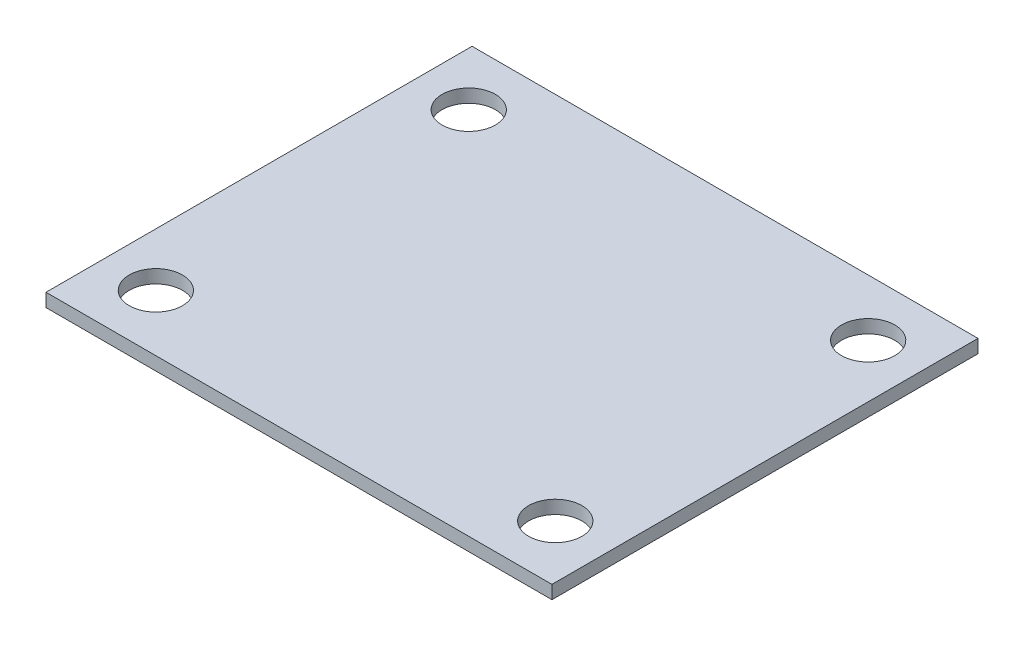
ISO-10303-21;
HEADER;
FILE_DESCRIPTION(('STEP AP214'),'2;1');
FILE_NAME('part.step','',(''),(''),'','','');
FILE_SCHEMA(('AUTOMOTIVE_DESIGN { 1 0 10303 214 1 1 1 1 }'));
ENDSEC;
DATA;
#1=APPLICATION_CONTEXT('core data for automotive mechanical design processes');
#2=APPLICATION_PROTOCOL_DEFINITION('international standard','automotive_design',2000,#1);
#3=PRODUCT_CONTEXT('',#1,'mechanical');
#4=PRODUCT('Part','Part','',(#3));
#5=PRODUCT_RELATED_PRODUCT_CATEGORY('part','',(#4));
#6=PRODUCT_DEFINITION_FORMATION('','',#4);
#7=PRODUCT_DEFINITION_CONTEXT('part definition',#1,'design');
#8=PRODUCT_DEFINITION('design','',#6,#7);
#9=PRODUCT_DEFINITION_SHAPE('','',#8);
#10=(LENGTH_UNIT() NAMED_UNIT(*) SI_UNIT(.MILLI.,.METRE.));
#11=(NAMED_UNIT(*) PLANE_ANGLE_UNIT() SI_UNIT($,.RADIAN.));
#12=(NAMED_UNIT(*) SI_UNIT($,.STERADIAN.) SOLID_ANGLE_UNIT());
#13=UNCERTAINTY_MEASURE_WITH_UNIT(LENGTH_MEASURE(1.E-05),#10,'distance_accuracy_value','');
#14=(GEOMETRIC_REPRESENTATION_CONTEXT(3) GLOBAL_UNCERTAINTY_ASSIGNED_CONTEXT((#13)) GLOBAL_UNIT_ASSIGNED_CONTEXT((#10,
#11,#12)) REPRESENTATION_CONTEXT('',''));
#15=CARTESIAN_POINT('',(0.,0.,0.));
#16=DIRECTION('',(0.,0.,1.));
#17=DIRECTION('',(1.,0.,0.));
#18=AXIS2_PLACEMENT_3D('',#15,#16,#17);
#19=CARTESIAN_POINT('',(0.,-2.,0.));
#20=DIRECTION('',(0.,-1.,0.));
#21=DIRECTION('',(0.,0.,-1.));
#22=AXIS2_PLACEMENT_3D('',#19,#20,#21);
#23=PLANE('',#22);
#24=CARTESIAN_POINT('',(0.,-2.,0.));
#25=DIRECTION('',(0.,-1.,0.));
#26=DIRECTION('',(0.,0.,-1.));
#27=AXIS2_PLACEMENT_3D('',#24,#25,#26);
#28=CIRCLE('',#27,12.);
#29=CARTESIAN_POINT('',(0.,-2.,-12.));
#30=VERTEX_POINT('',#29);
#31=EDGE_CURVE('E144',#30,#30,#28,.T.);
#32=ORIENTED_EDGE('',*,*,#31,.T.);
#33=EDGE_LOOP('',(#32));
#34=FACE_BOUND('',#33,.T.);
#35=CARTESIAN_POINT('',(0.,-2.,0.));
#36=DIRECTION('',(0.,-1.,0.));
#37=DIRECTION('',(0.,0.,-1.));
#38=AXIS2_PLACEMENT_3D('',#35,#36,#37);
#39=CIRCLE('',#38,9.);
#40=CARTESIAN_POINT('',(0.,-2.,-9.));
#41=VERTEX_POINT('',#40);
#42=EDGE_CURVE('E305',#41,#41,#39,.T.);
#43=ORIENTED_EDGE('',*,*,#42,.F.);
#44=EDGE_LOOP('',(#43));
#45=FACE_BOUND('',#44,.T.);
#46=ADVANCED_FACE('F38',(#34,#45),#23,.T.);
#47=CARTESIAN_POINT('',(-19.,1.,16.));
#48=DIRECTION('',(0.,1.,0.));
#49=DIRECTION('',(0.,0.,1.));
#50=AXIS2_PLACEMENT_3D('',#47,#48,#49);
#51=PLANE('',#50);
#52=CARTESIAN_POINT('',(-15.,1.,11.75));
#53=DIRECTION('',(0.,-1.,0.));
#54=DIRECTION('',(0.,0.,1.));
#55=AXIS2_PLACEMENT_3D('',#52,#53,#54);
#56=CIRCLE('',#55,2.00000000000001);
#57=CARTESIAN_POINT('',(-15.,1.,13.75));
#58=VERTEX_POINT('',#57);
#59=EDGE_CURVE('E124',#58,#58,#56,.T.);
#60=ORIENTED_EDGE('',*,*,#59,.T.);
#61=EDGE_LOOP('',(#60));
#62=FACE_BOUND('',#61,.T.);
#63=CARTESIAN_POINT('',(15.,1.,11.75));
#64=DIRECTION('',(0.,1.,0.));
#65=DIRECTION('',(0.,0.,1.));
#66=AXIS2_PLACEMENT_3D('',#63,#64,#65);
#67=CIRCLE('',#66,2.00000000000001);
#68=CARTESIAN_POINT('',(15.,1.,13.75));
#69=VERTEX_POINT('',#68);
#70=EDGE_CURVE('E118',#69,#69,#67,.T.);
#71=ORIENTED_EDGE('',*,*,#70,.F.);
#72=EDGE_LOOP('',(#71));
#73=FACE_BOUND('',#72,.T.);
#74=DIRECTION('',(0.,0.,1.));
#75=VECTOR('',#74,1.);
#76=CARTESIAN_POINT('',(-19.,1.,-16.));
#77=LINE('',#76,#75);
#78=CARTESIAN_POINT('',(-19.,1.,-16.));
#79=VERTEX_POINT('',#78);
#80=CARTESIAN_POINT('',(-19.,1.,16.));
#81=VERTEX_POINT('',#80);
#82=EDGE_CURVE('E91',#79,#81,#77,.T.);
#83=ORIENTED_EDGE('',*,*,#82,.T.);
#84=DIRECTION('',(1.,0.,0.));
#85=VECTOR('',#84,1.);
#86=CARTESIAN_POINT('',(-19.,1.,16.));
#87=LINE('',#86,#85);
#88=CARTESIAN_POINT('',(19.,1.,16.));
#89=VERTEX_POINT('',#88);
#90=EDGE_CURVE('E85',#81,#89,#87,.T.);
#91=ORIENTED_EDGE('',*,*,#90,.T.);
#92=DIRECTION('',(0.,0.,-1.));
#93=VECTOR('',#92,1.);
#94=CARTESIAN_POINT('',(19.,1.,-16.));
#95=LINE('',#94,#93);
#96=CARTESIAN_POINT('',(19.,1.,-16.));
#97=VERTEX_POINT('',#96);
#98=EDGE_CURVE('E89',#89,#97,#95,.T.);
#99=ORIENTED_EDGE('',*,*,#98,.T.);
#100=DIRECTION('',(-1.,0.,0.));
#101=VECTOR('',#100,1.);
#102=CARTESIAN_POINT('',(-19.,1.,-16.));
#103=LINE('',#102,#101);
#104=EDGE_CURVE('E55',#97,#79,#103,.T.);
#105=ORIENTED_EDGE('',*,*,#104,.T.);
#106=EDGE_LOOP('',(#83,#91,#99,#105));
#107=FACE_BOUND('',#106,.T.);
#108=CARTESIAN_POINT('',(-15.,1.,-11.75));
#109=DIRECTION('',(0.,1.,0.));
#110=DIRECTION('',(0.,0.,-1.));
#111=AXIS2_PLACEMENT_3D('',#108,#109,#110);
#112=CIRCLE('',#111,2.00000000000001);
#113=CARTESIAN_POINT('',(-15.,1.,-13.75));
#114=VERTEX_POINT('',#113);
#115=EDGE_CURVE('E130',#114,#114,#112,.T.);
#116=ORIENTED_EDGE('',*,*,#115,.F.);
#117=EDGE_LOOP('',(#116));
#118=FACE_BOUND('',#117,.T.);
#119=CARTESIAN_POINT('',(15.,1.,-11.75));
#120=DIRECTION('',(0.,-1.,0.));
#121=DIRECTION('',(0.,0.,-1.));
#122=AXIS2_PLACEMENT_3D('',#119,#120,#121);
#123=CIRCLE('',#122,2.00000000000001);
#124=CARTESIAN_POINT('',(15.,1.,-13.75));
#125=VERTEX_POINT('',#124);
#126=EDGE_CURVE('E136',#125,#125,#123,.T.);
#127=ORIENTED_EDGE('',*,*,#126,.T.);
#128=EDGE_LOOP('',(#127));
#129=FACE_BOUND('',#128,.T.);
#130=ADVANCED_FACE('F86',(#62,#73,#107,#118,#129),#51,.T.);
#131=CARTESIAN_POINT('',(-19.,0.,16.));
#132=DIRECTION('',(0.,1.,0.));
#133=DIRECTION('',(0.,0.,1.));
#134=AXIS2_PLACEMENT_3D('',#131,#132,#133);
#135=PLANE('',#134);
#136=CARTESIAN_POINT('',(0.,0.,0.));
#137=DIRECTION('',(0.,-1.,0.));
#138=DIRECTION('',(0.,0.,-1.));
#139=AXIS2_PLACEMENT_3D('',#136,#137,#138);
#140=CIRCLE('',#139,15.);
#141=CARTESIAN_POINT('',(0.,0.,-15.));
#142=VERTEX_POINT('',#141);
#143=EDGE_CURVE('E139',#142,#142,#140,.T.);
#144=ORIENTED_EDGE('',*,*,#143,.F.);
#145=EDGE_LOOP('',(#144));
#146=FACE_BOUND('',#145,.T.);
#147=CARTESIAN_POINT('',(-15.,0.,11.75));
#148=DIRECTION('',(0.,-1.,0.));
#149=DIRECTION('',(0.,0.,1.));
#150=AXIS2_PLACEMENT_3D('',#147,#148,#149);
#151=CIRCLE('',#150,2.00000000000001);
#152=CARTESIAN_POINT('',(-15.,0.,13.75));
#153=VERTEX_POINT('',#152);
#154=EDGE_CURVE('E121',#153,#153,#151,.T.);
#155=ORIENTED_EDGE('',*,*,#154,.F.);
#156=EDGE_LOOP('',(#155));
#157=FACE_BOUND('',#156,.T.);
#158=CARTESIAN_POINT('',(15.,0.,11.75));
#159=DIRECTION('',(0.,1.,0.));
#160=DIRECTION('',(0.,0.,1.));
#161=AXIS2_PLACEMENT_3D('',#158,#159,#160);
#162=CIRCLE('',#161,2.00000000000001);
#163=CARTESIAN_POINT('',(15.,0.,13.75));
#164=VERTEX_POINT('',#163);
#165=EDGE_CURVE('E106',#164,#164,#162,.T.);
#166=ORIENTED_EDGE('',*,*,#165,.T.);
#167=EDGE_LOOP('',(#166));
#168=FACE_BOUND('',#167,.T.);
#169=DIRECTION('',(0.,0.,1.));
#170=VECTOR('',#169,1.);
#171=CARTESIAN_POINT('',(-19.,0.,-16.));
#172=LINE('',#171,#170);
#173=CARTESIAN_POINT('',(-19.,0.,-16.));
#174=VERTEX_POINT('',#173);
#175=CARTESIAN_POINT('',(-19.,0.,16.));
#176=VERTEX_POINT('',#175);
#177=EDGE_CURVE('E103',#174,#176,#172,.T.);
#178=ORIENTED_EDGE('',*,*,#177,.F.);
#179=DIRECTION('',(-1.,0.,0.));
#180=VECTOR('',#179,1.);
#181=CARTESIAN_POINT('',(-19.,0.,-16.));
#182=LINE('',#181,#180);
#183=CARTESIAN_POINT('',(19.,0.,-16.));
#184=VERTEX_POINT('',#183);
#185=EDGE_CURVE('E78',#184,#174,#182,.T.);
#186=ORIENTED_EDGE('',*,*,#185,.F.);
#187=DIRECTION('',(0.,0.,-1.));
#188=VECTOR('',#187,1.);
#189=CARTESIAN_POINT('',(19.,0.,-16.));
#190=LINE('',#189,#188);
#191=CARTESIAN_POINT('',(19.,0.,16.));
#192=VERTEX_POINT('',#191);
#193=EDGE_CURVE('E72',#192,#184,#190,.T.);
#194=ORIENTED_EDGE('',*,*,#193,.F.);
#195=DIRECTION('',(1.,0.,0.));
#196=VECTOR('',#195,1.);
#197=CARTESIAN_POINT('',(-19.,0.,16.));
#198=LINE('',#197,#196);
#199=EDGE_CURVE('E95',#176,#192,#198,.T.);
#200=ORIENTED_EDGE('',*,*,#199,.F.);
#201=EDGE_LOOP('',(#178,#186,#194,#200));
#202=FACE_BOUND('',#201,.T.);
#203=CARTESIAN_POINT('',(-15.,0.,-11.75));
#204=DIRECTION('',(0.,1.,0.));
#205=DIRECTION('',(0.,0.,-1.));
#206=AXIS2_PLACEMENT_3D('',#203,#204,#205);
#207=CIRCLE('',#206,2.00000000000001);
#208=CARTESIAN_POINT('',(-15.,0.,-13.75));
#209=VERTEX_POINT('',#208);
#210=EDGE_CURVE('E127',#209,#209,#207,.T.);
#211=ORIENTED_EDGE('',*,*,#210,.T.);
#212=EDGE_LOOP('',(#211));
#213=FACE_BOUND('',#212,.T.);
#214=CARTESIAN_POINT('',(15.,0.,-11.75));
#215=DIRECTION('',(0.,-1.,0.));
#216=DIRECTION('',(0.,0.,-1.));
#217=AXIS2_PLACEMENT_3D('',#214,#215,#216);
#218=CIRCLE('',#217,2.00000000000001);
#219=CARTESIAN_POINT('',(15.,0.,-13.75));
#220=VERTEX_POINT('',#219);
#221=EDGE_CURVE('E133',#220,#220,#218,.T.);
#222=ORIENTED_EDGE('',*,*,#221,.F.);
#223=EDGE_LOOP('',(#222));
#224=FACE_BOUND('',#223,.T.);
#225=ADVANCED_FACE('F114',(#146,#157,#168,#202,#213,#224),#135,.F.);
#226=CARTESIAN_POINT('',(-19.,1.,-16.));
#227=DIRECTION('',(1.,0.,0.));
#228=DIRECTION('',(0.,0.,-1.));
#229=AXIS2_PLACEMENT_3D('',#226,#227,#228);
#230=PLANE('',#229);
#231=ORIENTED_EDGE('',*,*,#177,.T.);
#232=DIRECTION('',(0.,-1.,0.));
#233=VECTOR('',#232,1.);
#234=CARTESIAN_POINT('',(-19.,1.,16.));
#235=LINE('',#234,#233);
#236=EDGE_CURVE('E12',#81,#176,#235,.T.);
#237=ORIENTED_EDGE('',*,*,#236,.F.);
#238=ORIENTED_EDGE('',*,*,#82,.F.);
#239=DIRECTION('',(0.,-1.,0.));
#240=VECTOR('',#239,1.);
#241=CARTESIAN_POINT('',(-19.,1.,-16.));
#242=LINE('',#241,#240);
#243=EDGE_CURVE('E99',#79,#174,#242,.T.);
#244=ORIENTED_EDGE('',*,*,#243,.T.);
#245=EDGE_LOOP('',(#231,#237,#238,#244));
#246=FACE_BOUND('',#245,.T.);
#247=ADVANCED_FACE('F40',(#246),#230,.F.);
#248=CARTESIAN_POINT('',(-19.,1.,16.));
#249=DIRECTION('',(0.,0.,-1.));
#250=DIRECTION('',(-1.,0.,0.));
#251=AXIS2_PLACEMENT_3D('',#248,#249,#250);
#252=PLANE('',#251);
#253=ORIENTED_EDGE('',*,*,#199,.T.);
#254=DIRECTION('',(0.,-1.,0.));
#255=VECTOR('',#254,1.);
#256=CARTESIAN_POINT('',(19.,1.,16.));
#257=LINE('',#256,#255);
#258=EDGE_CURVE('E47',#89,#192,#257,.T.);
#259=ORIENTED_EDGE('',*,*,#258,.F.);
#260=ORIENTED_EDGE('',*,*,#90,.F.);
#261=ORIENTED_EDGE('',*,*,#236,.T.);
#262=EDGE_LOOP('',(#253,#259,#260,#261));
#263=FACE_BOUND('',#262,.T.);
#264=ADVANCED_FACE('F94',(#263),#252,.F.);
#265=CARTESIAN_POINT('',(19.,1.,-16.));
#266=DIRECTION('',(-1.,0.,0.));
#267=DIRECTION('',(0.,0.,1.));
#268=AXIS2_PLACEMENT_3D('',#265,#266,#267);
#269=PLANE('',#268);
#270=ORIENTED_EDGE('',*,*,#193,.T.);
#271=DIRECTION('',(0.,-1.,0.));
#272=VECTOR('',#271,1.);
#273=CARTESIAN_POINT('',(19.,1.,-16.));
#274=LINE('',#273,#272);
#275=EDGE_CURVE('E96',#97,#184,#274,.T.);
#276=ORIENTED_EDGE('',*,*,#275,.F.);
#277=ORIENTED_EDGE('',*,*,#98,.F.);
#278=ORIENTED_EDGE('',*,*,#258,.T.);
#279=EDGE_LOOP('',(#270,#276,#277,#278));
#280=FACE_BOUND('',#279,.T.);
#281=ADVANCED_FACE('F97',(#280),#269,.F.);
#282=CARTESIAN_POINT('',(-19.,1.,-16.));
#283=DIRECTION('',(0.,0.,1.));
#284=DIRECTION('',(1.,0.,0.));
#285=AXIS2_PLACEMENT_3D('',#282,#283,#284);
#286=PLANE('',#285);
#287=ORIENTED_EDGE('',*,*,#185,.T.);
#288=ORIENTED_EDGE('',*,*,#243,.F.);
#289=ORIENTED_EDGE('',*,*,#104,.F.);
#290=ORIENTED_EDGE('',*,*,#275,.T.);
#291=EDGE_LOOP('',(#287,#288,#289,#290));
#292=FACE_BOUND('',#291,.T.);
#293=ADVANCED_FACE('F111',(#292),#286,.F.);
#294=CARTESIAN_POINT('',(15.,0.,11.75));
#295=DIRECTION('',(0.,1.,0.));
#296=DIRECTION('',(0.,0.,1.));
#297=AXIS2_PLACEMENT_3D('',#294,#295,#296);
#298=CYLINDRICAL_SURFACE('',#297,2.00000000000001);
#299=ORIENTED_EDGE('',*,*,#165,.F.);
#300=EDGE_LOOP('',(#299));
#301=FACE_BOUND('',#300,.T.);
#302=ORIENTED_EDGE('',*,*,#70,.T.);
#303=EDGE_LOOP('',(#302));
#304=FACE_BOUND('',#303,.T.);
#305=ADVANCED_FACE('F177',(#301,#304),#298,.F.);
#306=CARTESIAN_POINT('',(-15.,0.,11.75));
#307=DIRECTION('',(0.,1.,0.));
#308=DIRECTION('',(0.,0.,1.));
#309=AXIS2_PLACEMENT_3D('',#306,#307,#308);
#310=CYLINDRICAL_SURFACE('',#309,2.00000000000001);
#311=ORIENTED_EDGE('',*,*,#154,.T.);
#312=EDGE_LOOP('',(#311));
#313=FACE_BOUND('',#312,.T.);
#314=ORIENTED_EDGE('',*,*,#59,.F.);
#315=EDGE_LOOP('',(#314));
#316=FACE_BOUND('',#315,.T.);
#317=ADVANCED_FACE('F173',(#313,#316),#310,.F.);
#318=CARTESIAN_POINT('',(-15.,0.,-11.75));
#319=DIRECTION('',(0.,1.,0.));
#320=DIRECTION('',(0.,0.,1.));
#321=AXIS2_PLACEMENT_3D('',#318,#319,#320);
#322=CYLINDRICAL_SURFACE('',#321,2.00000000000001);
#323=ORIENTED_EDGE('',*,*,#210,.F.);
#324=EDGE_LOOP('',(#323));
#325=FACE_BOUND('',#324,.T.);
#326=ORIENTED_EDGE('',*,*,#115,.T.);
#327=EDGE_LOOP('',(#326));
#328=FACE_BOUND('',#327,.T.);
#329=ADVANCED_FACE('F169',(#325,#328),#322,.F.);
#330=CARTESIAN_POINT('',(15.,0.,-11.75));
#331=DIRECTION('',(0.,1.,0.));
#332=DIRECTION('',(0.,0.,1.));
#333=AXIS2_PLACEMENT_3D('',#330,#331,#332);
#334=CYLINDRICAL_SURFACE('',#333,2.00000000000001);
#335=ORIENTED_EDGE('',*,*,#221,.T.);
#336=EDGE_LOOP('',(#335));
#337=FACE_BOUND('',#336,.T.);
#338=ORIENTED_EDGE('',*,*,#126,.F.);
#339=EDGE_LOOP('',(#338));
#340=FACE_BOUND('',#339,.T.);
#341=ADVANCED_FACE('F166',(#337,#340),#334,.F.);
#342=CARTESIAN_POINT('',(0.,-2.,0.));
#343=DIRECTION('',(0.,1.,0.));
#344=DIRECTION('',(0.,0.,1.));
#345=AXIS2_PLACEMENT_3D('',#342,#343,#344);
#346=CONICAL_SURFACE('',#345,12.,0.982793723247329);
#347=ORIENTED_EDGE('',*,*,#143,.T.);
#348=EDGE_LOOP('',(#347));
#349=FACE_BOUND('',#348,.T.);
#350=ORIENTED_EDGE('',*,*,#31,.F.);
#351=EDGE_LOOP('',(#350));
#352=FACE_BOUND('',#351,.T.);
#353=ADVANCED_FACE('F163',(#349,#352),#346,.T.);
#354=CARTESIAN_POINT('',(0.,-3.,0.));
#355=DIRECTION('',(0.,1.,0.));
#356=DIRECTION('',(0.,0.,1.));
#357=AXIS2_PLACEMENT_3D('',#354,#355,#356);
#358=CYLINDRICAL_SURFACE('',#357,9.);
#359=CARTESIAN_POINT('',(0.,-3.,0.));
#360=DIRECTION('',(0.,-1.,0.));
#361=DIRECTION('',(0.,0.,-1.));
#362=AXIS2_PLACEMENT_3D('',#359,#360,#361);
#363=CIRCLE('',#362,9.);
#364=CARTESIAN_POINT('',(0.,-3.,-9.));
#365=VERTEX_POINT('',#364);
#366=EDGE_CURVE('E147',#365,#365,#363,.T.);
#367=ORIENTED_EDGE('',*,*,#366,.F.);
#368=EDGE_LOOP('',(#367));
#369=FACE_BOUND('',#368,.T.);
#370=ORIENTED_EDGE('',*,*,#42,.T.);
#371=EDGE_LOOP('',(#370));
#372=FACE_BOUND('',#371,.T.);
#373=ADVANCED_FACE('F222',(#369,#372),#358,.T.);
#374=CARTESIAN_POINT('',(0.,-3.,0.));
#375=DIRECTION('',(0.,-1.,0.));
#376=DIRECTION('',(0.,0.,-1.));
#377=AXIS2_PLACEMENT_3D('',#374,#375,#376);
#378=PLANE('',#377);
#379=ORIENTED_EDGE('',*,*,#366,.T.);
#380=EDGE_LOOP('',(#379));
#381=FACE_BOUND('',#380,.T.);
#382=ADVANCED_FACE('F227',(#381),#378,.T.);
#383=CLOSED_SHELL('',(#46,#130,#225,#247,#264,#281,#293,#305,#317,#329,#341,#353,#373,#382));
#384=MANIFOLD_SOLID_BREP('B2',#383);
#385=ADVANCED_BREP_SHAPE_REPRESENTATION('',(#18,#384),#14);
#386=SHAPE_DEFINITION_REPRESENTATION(#9,#385);
ENDSEC;
END-ISO-10303-21;
